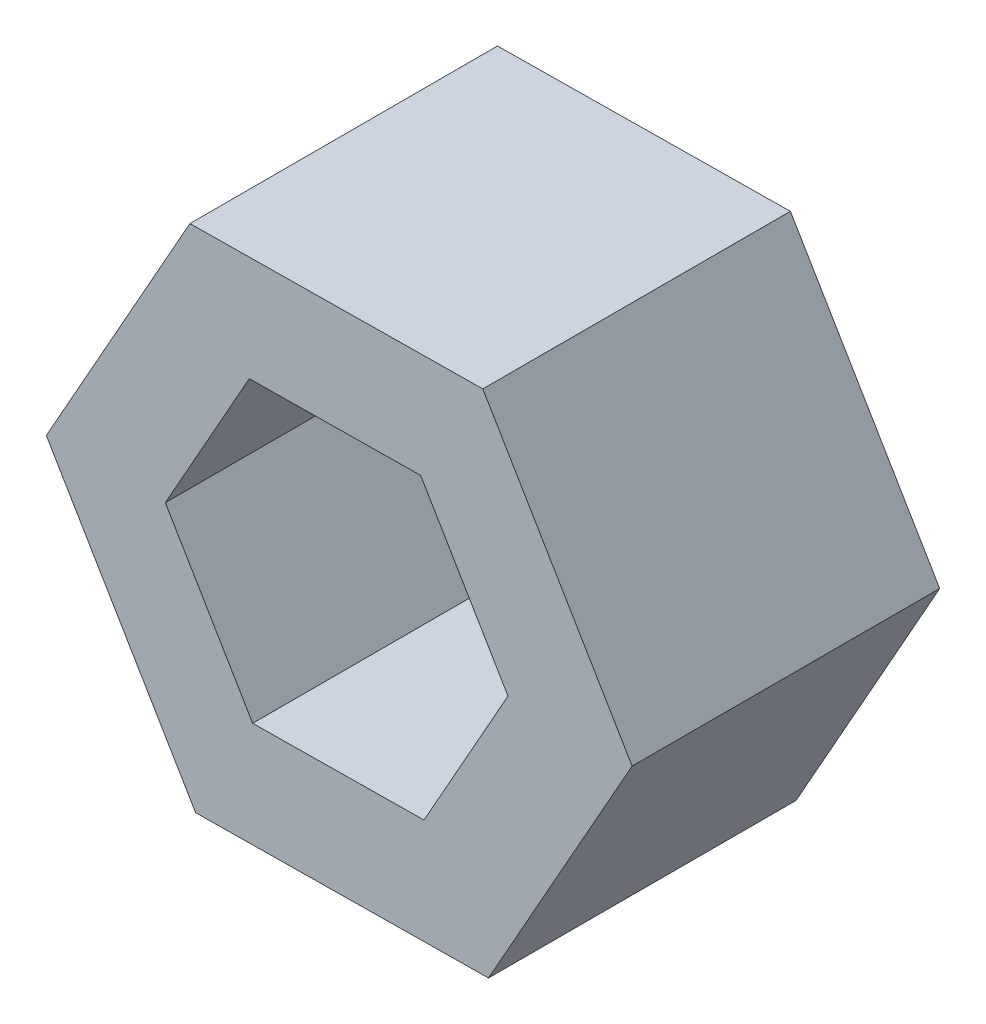
ISO-10303-21;
HEADER;
FILE_DESCRIPTION(('STEP AP214'),'2;1');
FILE_NAME('part.step','',(''),(''),'','','');
FILE_SCHEMA(('AUTOMOTIVE_DESIGN { 1 0 10303 214 1 1 1 1 }'));
ENDSEC;
DATA;
#1=APPLICATION_CONTEXT('core data for automotive mechanical design processes');
#2=APPLICATION_PROTOCOL_DEFINITION('international standard','automotive_design',2000,#1);
#3=PRODUCT_CONTEXT('',#1,'mechanical');
#4=PRODUCT('Part','Part','',(#3));
#5=PRODUCT_RELATED_PRODUCT_CATEGORY('part','',(#4));
#6=PRODUCT_DEFINITION_FORMATION('','',#4);
#7=PRODUCT_DEFINITION_CONTEXT('part definition',#1,'design');
#8=PRODUCT_DEFINITION('design','',#6,#7);
#9=PRODUCT_DEFINITION_SHAPE('','',#8);
#10=(LENGTH_UNIT() NAMED_UNIT(*) SI_UNIT(.MILLI.,.METRE.));
#11=(NAMED_UNIT(*) PLANE_ANGLE_UNIT() SI_UNIT($,.RADIAN.));
#12=(NAMED_UNIT(*) SI_UNIT($,.STERADIAN.) SOLID_ANGLE_UNIT());
#13=UNCERTAINTY_MEASURE_WITH_UNIT(LENGTH_MEASURE(1.E-05),#10,'distance_accuracy_value','');
#14=(GEOMETRIC_REPRESENTATION_CONTEXT(3) GLOBAL_UNCERTAINTY_ASSIGNED_CONTEXT((#13)) GLOBAL_UNIT_ASSIGNED_CONTEXT((#10,
#11,#12)) REPRESENTATION_CONTEXT('',''));
#15=CARTESIAN_POINT('',(0.,0.,0.));
#16=DIRECTION('',(0.,0.,1.));
#17=DIRECTION('',(1.,0.,0.));
#18=AXIS2_PLACEMENT_3D('',#15,#16,#17);
#19=CARTESIAN_POINT('',(-10.908566620423,0.388531299224089,4.85));
#20=DIRECTION('',(0.860366456574916,0.509675936650656,0.));
#21=DIRECTION('',(-0.509675936650656,0.860366456574916,0.));
#22=AXIS2_PLACEMENT_3D('',#19,#20,#21);
#23=PLANE('',#22);
#24=DIRECTION('',(0.509675936650656,-0.860366456574916,0.));
#25=VECTOR('',#24,1.);
#26=CARTESIAN_POINT('',(-10.908566620423,0.388531299224089,0.));
#27=LINE('',#26,#25);
#28=CARTESIAN_POINT('',(-10.908566620423,0.388531299224089,0.));
#29=VERTEX_POINT('',#28);
#30=CARTESIAN_POINT('',(-8.55447430662513,-3.58533114321793,0.));
#31=VERTEX_POINT('',#30);
#32=EDGE_CURVE('E193',#29,#31,#27,.T.);
#33=ORIENTED_EDGE('',*,*,#32,.T.);
#34=DIRECTION('',(0.,0.,-1.));
#35=VECTOR('',#34,1.);
#36=CARTESIAN_POINT('',(-8.55447430662513,-3.58533114321793,4.85));
#37=LINE('',#36,#35);
#38=CARTESIAN_POINT('',(-8.55447430662513,-3.58533114321793,4.85));
#39=VERTEX_POINT('',#38);
#40=EDGE_CURVE('E11',#39,#31,#37,.T.);
#41=ORIENTED_EDGE('',*,*,#40,.F.);
#42=DIRECTION('',(0.509675936650656,-0.860366456574916,0.));
#43=VECTOR('',#42,1.);
#44=CARTESIAN_POINT('',(-10.908566620423,0.388531299224089,4.85));
#45=LINE('',#44,#43);
#46=CARTESIAN_POINT('',(-10.908566620423,0.388531299224089,4.85));
#47=VERTEX_POINT('',#46);
#48=EDGE_CURVE('E205',#47,#39,#45,.T.);
#49=ORIENTED_EDGE('',*,*,#48,.F.);
#50=DIRECTION('',(0.,0.,-1.));
#51=VECTOR('',#50,1.);
#52=CARTESIAN_POINT('',(-10.908566620423,0.388531299224089,4.85));
#53=LINE('',#52,#51);
#54=EDGE_CURVE('E225',#47,#29,#53,.T.);
#55=ORIENTED_EDGE('',*,*,#54,.T.);
#56=EDGE_LOOP('',(#33,#41,#49,#55));
#57=FACE_BOUND('',#56,.T.);
#58=ADVANCED_FACE('F45',(#57),#23,.F.);
#59=CARTESIAN_POINT('',(-8.55447430662513,-3.58533114321793,4.85));
#60=DIRECTION('',(-0.0112090805496393,0.999937176283206,0.));
#61=DIRECTION('',(-0.999937176283206,-0.0112090805496393,0.));
#62=AXIS2_PLACEMENT_3D('',#59,#60,#61);
#63=PLANE('',#62);
#64=DIRECTION('',(0.999937176283206,0.0112090805496393,0.));
#65=VECTOR('',#64,1.);
#66=CARTESIAN_POINT('',(-8.55447430662513,-3.58533114321793,0.));
#67=LINE('',#66,#65);
#68=CARTESIAN_POINT('',(-3.93596232342654,-3.53355861783631,0.));
#69=VERTEX_POINT('',#68);
#70=EDGE_CURVE('E229',#31,#69,#67,.T.);
#71=ORIENTED_EDGE('',*,*,#70,.T.);
#72=DIRECTION('',(0.,0.,-1.));
#73=VECTOR('',#72,1.);
#74=CARTESIAN_POINT('',(-3.93596232342654,-3.53355861783631,4.85));
#75=LINE('',#74,#73);
#76=CARTESIAN_POINT('',(-3.93596232342654,-3.53355861783631,4.85));
#77=VERTEX_POINT('',#76);
#78=EDGE_CURVE('E53',#77,#69,#75,.T.);
#79=ORIENTED_EDGE('',*,*,#78,.F.);
#80=DIRECTION('',(0.999937176283206,0.0112090805496393,0.));
#81=VECTOR('',#80,1.);
#82=CARTESIAN_POINT('',(-8.55447430662513,-3.58533114321793,4.85));
#83=LINE('',#82,#81);
#84=EDGE_CURVE('E209',#39,#77,#83,.T.);
#85=ORIENTED_EDGE('',*,*,#84,.F.);
#86=ORIENTED_EDGE('',*,*,#40,.T.);
#87=EDGE_LOOP('',(#71,#79,#85,#86));
#88=FACE_BOUND('',#87,.T.);
#89=ADVANCED_FACE('F284',(#88),#63,.F.);
#90=CARTESIAN_POINT('',(-3.93596232342654,-3.53355861783631,4.85));
#91=DIRECTION('',(-0.871575537124555,0.490261239632549,0.));
#92=DIRECTION('',(-0.490261239632549,-0.871575537124555,0.));
#93=AXIS2_PLACEMENT_3D('',#90,#91,#92);
#94=PLANE('',#93);
#95=DIRECTION('',(0.490261239632549,0.871575537124555,0.));
#96=VECTOR('',#95,1.);
#97=CARTESIAN_POINT('',(-3.93596232342654,-3.53355861783631,0.));
#98=LINE('',#97,#96);
#99=CARTESIAN_POINT('',(-1.67154265402581,0.49207634998733,0.));
#100=VERTEX_POINT('',#99);
#101=EDGE_CURVE('E232',#69,#100,#98,.T.);
#102=ORIENTED_EDGE('',*,*,#101,.T.);
#103=DIRECTION('',(0.,0.,-1.));
#104=VECTOR('',#103,1.);
#105=CARTESIAN_POINT('',(-1.67154265402581,0.49207634998733,4.85));
#106=LINE('',#105,#104);
#107=CARTESIAN_POINT('',(-1.67154265402581,0.49207634998733,4.85));
#108=VERTEX_POINT('',#107);
#109=EDGE_CURVE('E254',#108,#100,#106,.T.);
#110=ORIENTED_EDGE('',*,*,#109,.F.);
#111=DIRECTION('',(0.490261239632549,0.871575537124555,0.));
#112=VECTOR('',#111,1.);
#113=CARTESIAN_POINT('',(-3.93596232342654,-3.53355861783631,4.85));
#114=LINE('',#113,#112);
#115=EDGE_CURVE('E213',#77,#108,#114,.T.);
#116=ORIENTED_EDGE('',*,*,#115,.F.);
#117=ORIENTED_EDGE('',*,*,#78,.T.);
#118=EDGE_LOOP('',(#102,#110,#116,#117));
#119=FACE_BOUND('',#118,.T.);
#120=ADVANCED_FACE('F263',(#119),#94,.F.);
#121=CARTESIAN_POINT('',(-1.67154265402581,0.49207634998733,4.85));
#122=DIRECTION('',(-0.860366456574916,-0.509675936650656,0.));
#123=DIRECTION('',(0.509675936650656,-0.860366456574916,0.));
#124=AXIS2_PLACEMENT_3D('',#121,#122,#123);
#125=PLANE('',#124);
#126=DIRECTION('',(-0.509675936650656,0.860366456574916,0.));
#127=VECTOR('',#126,1.);
#128=CARTESIAN_POINT('',(-1.67154265402581,0.49207634998733,0.));
#129=LINE('',#128,#127);
#130=CARTESIAN_POINT('',(-4.02563496782365,4.46593879242934,0.));
#131=VERTEX_POINT('',#130);
#132=EDGE_CURVE('E235',#100,#131,#129,.T.);
#133=ORIENTED_EDGE('',*,*,#132,.T.);
#134=DIRECTION('',(0.,0.,-1.));
#135=VECTOR('',#134,1.);
#136=CARTESIAN_POINT('',(-4.02563496782365,4.46593879242934,4.85));
#137=LINE('',#136,#135);
#138=CARTESIAN_POINT('',(-4.02563496782365,4.46593879242934,4.85));
#139=VERTEX_POINT('',#138);
#140=EDGE_CURVE('E250',#139,#131,#137,.T.);
#141=ORIENTED_EDGE('',*,*,#140,.F.);
#142=DIRECTION('',(-0.509675936650656,0.860366456574916,0.));
#143=VECTOR('',#142,1.);
#144=CARTESIAN_POINT('',(-1.67154265402581,0.49207634998733,4.85));
#145=LINE('',#144,#143);
#146=EDGE_CURVE('E216',#108,#139,#145,.T.);
#147=ORIENTED_EDGE('',*,*,#146,.F.);
#148=ORIENTED_EDGE('',*,*,#109,.T.);
#149=EDGE_LOOP('',(#133,#141,#147,#148));
#150=FACE_BOUND('',#149,.T.);
#151=ADVANCED_FACE('F272',(#150),#125,.F.);
#152=CARTESIAN_POINT('',(-4.02563496782365,4.46593879242934,4.85));
#153=DIRECTION('',(0.0112090805496393,-0.999937176283206,0.));
#154=DIRECTION('',(0.999937176283206,0.0112090805496393,0.));
#155=AXIS2_PLACEMENT_3D('',#152,#153,#154);
#156=PLANE('',#155);
#157=DIRECTION('',(-0.999937176283206,-0.0112090805496393,0.));
#158=VECTOR('',#157,1.);
#159=CARTESIAN_POINT('',(-4.02563496782365,4.46593879242934,0.));
#160=LINE('',#159,#158);
#161=CARTESIAN_POINT('',(-8.64414695102225,4.41416626704772,0.));
#162=VERTEX_POINT('',#161);
#163=EDGE_CURVE('E238',#131,#162,#160,.T.);
#164=ORIENTED_EDGE('',*,*,#163,.T.);
#165=DIRECTION('',(0.,0.,-1.));
#166=VECTOR('',#165,1.);
#167=CARTESIAN_POINT('',(-8.64414695102225,4.41416626704772,4.85));
#168=LINE('',#167,#166);
#169=CARTESIAN_POINT('',(-8.64414695102225,4.41416626704772,4.85));
#170=VERTEX_POINT('',#169);
#171=EDGE_CURVE('E246',#170,#162,#168,.T.);
#172=ORIENTED_EDGE('',*,*,#171,.F.);
#173=DIRECTION('',(-0.999937176283206,-0.0112090805496393,0.));
#174=VECTOR('',#173,1.);
#175=CARTESIAN_POINT('',(-4.02563496782365,4.46593879242934,4.85));
#176=LINE('',#175,#174);
#177=EDGE_CURVE('E219',#139,#170,#176,.T.);
#178=ORIENTED_EDGE('',*,*,#177,.F.);
#179=ORIENTED_EDGE('',*,*,#140,.T.);
#180=EDGE_LOOP('',(#164,#172,#178,#179));
#181=FACE_BOUND('',#180,.T.);
#182=ADVANCED_FACE('F276',(#181),#156,.F.);
#183=CARTESIAN_POINT('',(-8.64414695102225,4.41416626704772,4.85));
#184=DIRECTION('',(0.871575537124555,-0.490261239632549,0.));
#185=DIRECTION('',(0.490261239632549,0.871575537124555,0.));
#186=AXIS2_PLACEMENT_3D('',#183,#184,#185);
#187=PLANE('',#186);
#188=DIRECTION('',(-0.490261239632549,-0.871575537124555,0.));
#189=VECTOR('',#188,1.);
#190=CARTESIAN_POINT('',(-8.64414695102225,4.41416626704772,0.));
#191=LINE('',#190,#189);
#192=EDGE_CURVE('E210',#162,#29,#191,.T.);
#193=ORIENTED_EDGE('',*,*,#192,.T.);
#194=ORIENTED_EDGE('',*,*,#54,.F.);
#195=DIRECTION('',(-0.490261239632549,-0.871575537124555,0.));
#196=VECTOR('',#195,1.);
#197=CARTESIAN_POINT('',(-8.64414695102225,4.41416626704772,4.85));
#198=LINE('',#197,#196);
#199=EDGE_CURVE('E222',#170,#47,#198,.T.);
#200=ORIENTED_EDGE('',*,*,#199,.F.);
#201=ORIENTED_EDGE('',*,*,#171,.T.);
#202=EDGE_LOOP('',(#193,#194,#200,#201));
#203=FACE_BOUND('',#202,.T.);
#204=ADVANCED_FACE('F287',(#203),#187,.F.);
#205=CARTESIAN_POINT('',(0.,0.,4.85));
#206=DIRECTION('',(0.,0.,1.));
#207=DIRECTION('',(1.,0.,0.));
#208=AXIS2_PLACEMENT_3D('',#205,#206,#207);
#209=PLANE('',#208);
#210=DIRECTION('',(0.999937176283206,0.0112090805496395,0.));
#211=VECTOR('',#210,1.);
#212=CARTESIAN_POINT('',(-7.65481248147036,-1.91514183385217,4.85));
#213=LINE('',#212,#211);
#214=CARTESIAN_POINT('',(-7.65481248147036,-1.91514183385217,4.85));
#215=VERTEX_POINT('',#214);
#216=CARTESIAN_POINT('',(-4.95298297129919,-1.88485490650392,4.85));
#217=VERTEX_POINT('',#216);
#218=EDGE_CURVE('E60',#215,#217,#213,.T.);
#219=ORIENTED_EDGE('',*,*,#218,.F.);
#220=DIRECTION('',(0.509675936650657,-0.860366456574916,0.));
#221=VECTOR('',#220,1.);
#222=CARTESIAN_POINT('',(-9.03195648504211,0.409567694976412,4.85));
#223=LINE('',#222,#221);
#224=CARTESIAN_POINT('',(-9.03195648504211,0.409567694976412,4.85));
#225=VERTEX_POINT('',#224);
#226=EDGE_CURVE('E156',#225,#215,#223,.T.);
#227=ORIENTED_EDGE('',*,*,#226,.F.);
#228=DIRECTION('',(-0.49026123963255,-0.871575537124555,0.));
#229=VECTOR('',#228,1.);
#230=CARTESIAN_POINT('',(-7.70727097844268,2.76456415115324,4.85));
#231=LINE('',#230,#229);
#232=CARTESIAN_POINT('',(-7.70727097844268,2.76456415115324,4.85));
#233=VERTEX_POINT('',#232);
#234=EDGE_CURVE('E160',#233,#225,#231,.T.);
#235=ORIENTED_EDGE('',*,*,#234,.F.);
#236=DIRECTION('',(-0.999937176283206,-0.0112090805496394,0.));
#237=VECTOR('',#236,1.);
#238=CARTESIAN_POINT('',(-5.0054414682715,2.79485107850149,4.85));
#239=LINE('',#238,#237);
#240=CARTESIAN_POINT('',(-5.0054414682715,2.79485107850149,4.85));
#241=VERTEX_POINT('',#240);
#242=EDGE_CURVE('E183',#241,#233,#239,.T.);
#243=ORIENTED_EDGE('',*,*,#242,.F.);
#244=DIRECTION('',(-0.509675936650657,0.860366456574915,0.));
#245=VECTOR('',#244,1.);
#246=CARTESIAN_POINT('',(-3.62829746469976,0.470141549672905,4.85));
#247=LINE('',#246,#245);
#248=CARTESIAN_POINT('',(-3.62829746469976,0.470141549672905,4.85));
#249=VERTEX_POINT('',#248);
#250=EDGE_CURVE('E179',#249,#241,#247,.T.);
#251=ORIENTED_EDGE('',*,*,#250,.F.);
#252=DIRECTION('',(0.49026123963255,0.871575537124554,0.));
#253=VECTOR('',#252,1.);
#254=CARTESIAN_POINT('',(-4.95298297129919,-1.88485490650392,4.85));
#255=LINE('',#254,#253);
#256=EDGE_CURVE('E176',#217,#249,#255,.T.);
#257=ORIENTED_EDGE('',*,*,#256,.F.);
#258=EDGE_LOOP('',(#219,#227,#235,#243,#251,#257));
#259=FACE_BOUND('',#258,.T.);
#260=ORIENTED_EDGE('',*,*,#48,.T.);
#261=ORIENTED_EDGE('',*,*,#84,.T.);
#262=ORIENTED_EDGE('',*,*,#115,.T.);
#263=ORIENTED_EDGE('',*,*,#146,.T.);
#264=ORIENTED_EDGE('',*,*,#177,.T.);
#265=ORIENTED_EDGE('',*,*,#199,.T.);
#266=EDGE_LOOP('',(#260,#261,#262,#263,#264,#265));
#267=FACE_BOUND('',#266,.T.);
#268=ADVANCED_FACE('F280',(#259,#267),#209,.T.);
#269=CARTESIAN_POINT('',(0.,0.,0.));
#270=DIRECTION('',(0.,0.,1.));
#271=DIRECTION('',(1.,0.,0.));
#272=AXIS2_PLACEMENT_3D('',#269,#270,#271);
#273=PLANE('',#272);
#274=DIRECTION('',(0.509675936650657,-0.860366456574916,0.));
#275=VECTOR('',#274,1.);
#276=CARTESIAN_POINT('',(-9.03195648504211,0.409567694976412,0.));
#277=LINE('',#276,#275);
#278=CARTESIAN_POINT('',(-9.03195648504211,0.409567694976412,0.));
#279=VERTEX_POINT('',#278);
#280=CARTESIAN_POINT('',(-7.65481248147036,-1.91514183385217,0.));
#281=VERTEX_POINT('',#280);
#282=EDGE_CURVE('E143',#279,#281,#277,.T.);
#283=ORIENTED_EDGE('',*,*,#282,.T.);
#284=DIRECTION('',(0.999937176283206,0.0112090805496395,0.));
#285=VECTOR('',#284,1.);
#286=CARTESIAN_POINT('',(-7.65481248147036,-1.91514183385217,0.));
#287=LINE('',#286,#285);
#288=CARTESIAN_POINT('',(-4.95298297129919,-1.88485490650392,0.));
#289=VERTEX_POINT('',#288);
#290=EDGE_CURVE('E136',#281,#289,#287,.T.);
#291=ORIENTED_EDGE('',*,*,#290,.T.);
#292=DIRECTION('',(0.49026123963255,0.871575537124554,0.));
#293=VECTOR('',#292,1.);
#294=CARTESIAN_POINT('',(-4.95298297129919,-1.88485490650392,0.));
#295=LINE('',#294,#293);
#296=CARTESIAN_POINT('',(-3.62829746469976,0.470141549672905,0.));
#297=VERTEX_POINT('',#296);
#298=EDGE_CURVE('E146',#289,#297,#295,.T.);
#299=ORIENTED_EDGE('',*,*,#298,.T.);
#300=DIRECTION('',(-0.509675936650657,0.860366456574915,0.));
#301=VECTOR('',#300,1.);
#302=CARTESIAN_POINT('',(-3.62829746469976,0.470141549672905,0.));
#303=LINE('',#302,#301);
#304=CARTESIAN_POINT('',(-5.0054414682715,2.79485107850149,0.));
#305=VERTEX_POINT('',#304);
#306=EDGE_CURVE('E68',#297,#305,#303,.T.);
#307=ORIENTED_EDGE('',*,*,#306,.T.);
#308=DIRECTION('',(-0.999937176283206,-0.0112090805496394,0.));
#309=VECTOR('',#308,1.);
#310=CARTESIAN_POINT('',(-5.0054414682715,2.79485107850149,0.));
#311=LINE('',#310,#309);
#312=CARTESIAN_POINT('',(-7.70727097844268,2.76456415115324,0.));
#313=VERTEX_POINT('',#312);
#314=EDGE_CURVE('E165',#305,#313,#311,.T.);
#315=ORIENTED_EDGE('',*,*,#314,.T.);
#316=DIRECTION('',(-0.49026123963255,-0.871575537124555,0.));
#317=VECTOR('',#316,1.);
#318=CARTESIAN_POINT('',(-7.70727097844268,2.76456415115324,0.));
#319=LINE('',#318,#317);
#320=EDGE_CURVE('E169',#313,#279,#319,.T.);
#321=ORIENTED_EDGE('',*,*,#320,.T.);
#322=EDGE_LOOP('',(#283,#291,#299,#307,#315,#321));
#323=FACE_BOUND('',#322,.T.);
#324=ORIENTED_EDGE('',*,*,#32,.F.);
#325=ORIENTED_EDGE('',*,*,#192,.F.);
#326=ORIENTED_EDGE('',*,*,#163,.F.);
#327=ORIENTED_EDGE('',*,*,#132,.F.);
#328=ORIENTED_EDGE('',*,*,#101,.F.);
#329=ORIENTED_EDGE('',*,*,#70,.F.);
#330=EDGE_LOOP('',(#324,#325,#326,#327,#328,#329));
#331=FACE_BOUND('',#330,.T.);
#332=ADVANCED_FACE('F151',(#323,#331),#273,.F.);
#333=CARTESIAN_POINT('',(-7.65481248147036,-1.91514183385217,0.));
#334=DIRECTION('',(0.0112090805496395,-0.999937176283206,0.));
#335=DIRECTION('',(0.999937176283206,0.0112090805496395,0.));
#336=AXIS2_PLACEMENT_3D('',#333,#334,#335);
#337=PLANE('',#336);
#338=ORIENTED_EDGE('',*,*,#218,.T.);
#339=DIRECTION('',(0.,0.,1.));
#340=VECTOR('',#339,1.);
#341=CARTESIAN_POINT('',(-4.95298297129919,-1.88485490650392,0.));
#342=LINE('',#341,#340);
#343=EDGE_CURVE('E132',#289,#217,#342,.T.);
#344=ORIENTED_EDGE('',*,*,#343,.F.);
#345=ORIENTED_EDGE('',*,*,#290,.F.);
#346=DIRECTION('',(0.,0.,1.));
#347=VECTOR('',#346,1.);
#348=CARTESIAN_POINT('',(-7.65481248147036,-1.91514183385217,0.));
#349=LINE('',#348,#347);
#350=EDGE_CURVE('E190',#281,#215,#349,.T.);
#351=ORIENTED_EDGE('',*,*,#350,.T.);
#352=EDGE_LOOP('',(#338,#344,#345,#351));
#353=FACE_BOUND('',#352,.T.);
#354=ADVANCED_FACE('F134',(#353),#337,.F.);
#355=CARTESIAN_POINT('',(-9.03195648504211,0.409567694976412,0.));
#356=DIRECTION('',(-0.860366456574916,-0.509675936650657,0.));
#357=DIRECTION('',(0.509675936650657,-0.860366456574916,0.));
#358=AXIS2_PLACEMENT_3D('',#355,#356,#357);
#359=PLANE('',#358);
#360=ORIENTED_EDGE('',*,*,#226,.T.);
#361=ORIENTED_EDGE('',*,*,#350,.F.);
#362=ORIENTED_EDGE('',*,*,#282,.F.);
#363=DIRECTION('',(0.,0.,1.));
#364=VECTOR('',#363,1.);
#365=CARTESIAN_POINT('',(-9.03195648504211,0.409567694976412,0.));
#366=LINE('',#365,#364);
#367=EDGE_CURVE('E194',#279,#225,#366,.T.);
#368=ORIENTED_EDGE('',*,*,#367,.T.);
#369=EDGE_LOOP('',(#360,#361,#362,#368));
#370=FACE_BOUND('',#369,.T.);
#371=ADVANCED_FACE('F344',(#370),#359,.F.);
#372=CARTESIAN_POINT('',(-7.70727097844268,2.76456415115324,0.));
#373=DIRECTION('',(-0.871575537124554,0.49026123963255,0.));
#374=DIRECTION('',(-0.49026123963255,-0.871575537124555,0.));
#375=AXIS2_PLACEMENT_3D('',#372,#373,#374);
#376=PLANE('',#375);
#377=ORIENTED_EDGE('',*,*,#234,.T.);
#378=ORIENTED_EDGE('',*,*,#367,.F.);
#379=ORIENTED_EDGE('',*,*,#320,.F.);
#380=DIRECTION('',(0.,0.,1.));
#381=VECTOR('',#380,1.);
#382=CARTESIAN_POINT('',(-7.70727097844268,2.76456415115324,0.));
#383=LINE('',#382,#381);
#384=EDGE_CURVE('E197',#313,#233,#383,.T.);
#385=ORIENTED_EDGE('',*,*,#384,.T.);
#386=EDGE_LOOP('',(#377,#378,#379,#385));
#387=FACE_BOUND('',#386,.T.);
#388=ADVANCED_FACE('F353',(#387),#376,.F.);
#389=CARTESIAN_POINT('',(-5.0054414682715,2.79485107850149,0.));
#390=DIRECTION('',(-0.0112090805496394,0.999937176283206,0.));
#391=DIRECTION('',(-0.999937176283206,-0.0112090805496394,0.));
#392=AXIS2_PLACEMENT_3D('',#389,#390,#391);
#393=PLANE('',#392);
#394=ORIENTED_EDGE('',*,*,#242,.T.);
#395=ORIENTED_EDGE('',*,*,#384,.F.);
#396=ORIENTED_EDGE('',*,*,#314,.F.);
#397=DIRECTION('',(0.,0.,1.));
#398=VECTOR('',#397,1.);
#399=CARTESIAN_POINT('',(-5.0054414682715,2.79485107850149,0.));
#400=LINE('',#399,#398);
#401=EDGE_CURVE('E200',#305,#241,#400,.T.);
#402=ORIENTED_EDGE('',*,*,#401,.T.);
#403=EDGE_LOOP('',(#394,#395,#396,#402));
#404=FACE_BOUND('',#403,.T.);
#405=ADVANCED_FACE('F363',(#404),#393,.F.);
#406=CARTESIAN_POINT('',(-3.62829746469976,0.470141549672905,0.));
#407=DIRECTION('',(0.860366456574915,0.509675936650657,0.));
#408=DIRECTION('',(-0.509675936650657,0.860366456574915,0.));
#409=AXIS2_PLACEMENT_3D('',#406,#407,#408);
#410=PLANE('',#409);
#411=ORIENTED_EDGE('',*,*,#250,.T.);
#412=ORIENTED_EDGE('',*,*,#401,.F.);
#413=ORIENTED_EDGE('',*,*,#306,.F.);
#414=DIRECTION('',(0.,0.,1.));
#415=VECTOR('',#414,1.);
#416=CARTESIAN_POINT('',(-3.62829746469976,0.470141549672905,0.));
#417=LINE('',#416,#415);
#418=EDGE_CURVE('E142',#297,#249,#417,.T.);
#419=ORIENTED_EDGE('',*,*,#418,.T.);
#420=EDGE_LOOP('',(#411,#412,#413,#419));
#421=FACE_BOUND('',#420,.T.);
#422=ADVANCED_FACE('F373',(#421),#410,.F.);
#423=CARTESIAN_POINT('',(-4.95298297129919,-1.88485490650392,0.));
#424=DIRECTION('',(0.871575537124554,-0.49026123963255,0.));
#425=DIRECTION('',(0.49026123963255,0.871575537124554,0.));
#426=AXIS2_PLACEMENT_3D('',#423,#424,#425);
#427=PLANE('',#426);
#428=ORIENTED_EDGE('',*,*,#256,.T.);
#429=ORIENTED_EDGE('',*,*,#418,.F.);
#430=ORIENTED_EDGE('',*,*,#298,.F.);
#431=ORIENTED_EDGE('',*,*,#343,.T.);
#432=EDGE_LOOP('',(#428,#429,#430,#431));
#433=FACE_BOUND('',#432,.T.);
#434=ADVANCED_FACE('F147',(#433),#427,.F.);
#435=CLOSED_SHELL('',(#58,#89,#120,#151,#182,#204,#268,#332,#354,#371,#388,#405,#422,#434));
#436=MANIFOLD_SOLID_BREP('B2',#435);
#437=ADVANCED_BREP_SHAPE_REPRESENTATION('',(#18,#436),#14);
#438=SHAPE_DEFINITION_REPRESENTATION(#9,#437);
ENDSEC;
END-ISO-10303-21;
